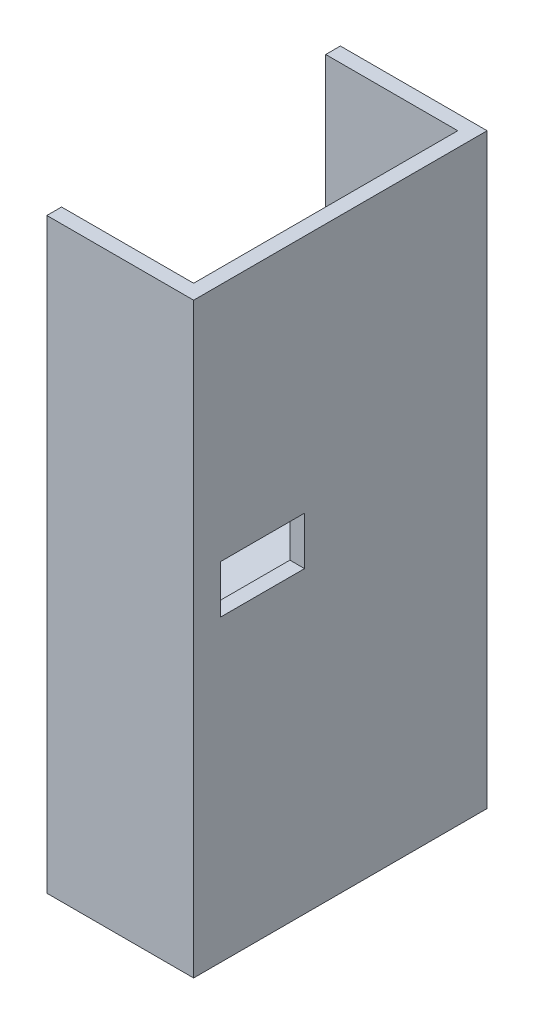
ISO-10303-21;
HEADER;
FILE_DESCRIPTION(('STEP AP214'),'2;1');
FILE_NAME('part.step','',(''),(''),'','','');
FILE_SCHEMA(('AUTOMOTIVE_DESIGN { 1 0 10303 214 1 1 1 1 }'));
ENDSEC;
DATA;
#1=APPLICATION_CONTEXT('core data for automotive mechanical design processes');
#2=APPLICATION_PROTOCOL_DEFINITION('international standard','automotive_design',2000,#1);
#3=PRODUCT_CONTEXT('',#1,'mechanical');
#4=PRODUCT('Part','Part','',(#3));
#5=PRODUCT_RELATED_PRODUCT_CATEGORY('part','',(#4));
#6=PRODUCT_DEFINITION_FORMATION('','',#4);
#7=PRODUCT_DEFINITION_CONTEXT('part definition',#1,'design');
#8=PRODUCT_DEFINITION('design','',#6,#7);
#9=PRODUCT_DEFINITION_SHAPE('','',#8);
#10=(LENGTH_UNIT() NAMED_UNIT(*) SI_UNIT(.MILLI.,.METRE.));
#11=(NAMED_UNIT(*) PLANE_ANGLE_UNIT() SI_UNIT($,.RADIAN.));
#12=(NAMED_UNIT(*) SI_UNIT($,.STERADIAN.) SOLID_ANGLE_UNIT());
#13=UNCERTAINTY_MEASURE_WITH_UNIT(LENGTH_MEASURE(1.E-05),#10,'distance_accuracy_value','');
#14=(GEOMETRIC_REPRESENTATION_CONTEXT(3) GLOBAL_UNCERTAINTY_ASSIGNED_CONTEXT((#13)) GLOBAL_UNIT_ASSIGNED_CONTEXT((#10,
#11,#12)) REPRESENTATION_CONTEXT('',''));
#15=CARTESIAN_POINT('',(0.,0.,0.));
#16=DIRECTION('',(0.,0.,1.));
#17=DIRECTION('',(1.,0.,0.));
#18=AXIS2_PLACEMENT_3D('',#15,#16,#17);
#19=CARTESIAN_POINT('',(0.,-0.00999999999999612,0.));
#20=DIRECTION('',(-1.,0.,0.));
#21=DIRECTION('',(0.,0.,1.));
#22=AXIS2_PLACEMENT_3D('',#19,#20,#21);
#23=PLANE('',#22);
#24=DIRECTION('',(0.,-1.,0.));
#25=VECTOR('',#24,1.);
#26=CARTESIAN_POINT('',(0.,80.,-20.));
#27=LINE('',#26,#25);
#28=CARTESIAN_POINT('',(0.,80.,-20.));
#29=VERTEX_POINT('',#28);
#30=CARTESIAN_POINT('',(0.,0.,-20.));
#31=VERTEX_POINT('',#30);
#32=EDGE_CURVE('E245',#29,#31,#27,.T.);
#33=ORIENTED_EDGE('',*,*,#32,.T.);
#34=DIRECTION('',(0.,0.,1.));
#35=VECTOR('',#34,1.);
#36=CARTESIAN_POINT('',(0.,0.,0.));
#37=LINE('',#36,#35);
#38=CARTESIAN_POINT('',(0.,0.,-12.5));
#39=VERTEX_POINT('',#38);
#40=EDGE_CURVE('E251',#31,#39,#37,.T.);
#41=ORIENTED_EDGE('',*,*,#40,.T.);
#42=DIRECTION('',(0.,-1.,0.));
#43=VECTOR('',#42,1.);
#44=CARTESIAN_POINT('',(0.,20.,-12.5));
#45=LINE('',#44,#43);
#46=CARTESIAN_POINT('',(0.,20.,-12.5));
#47=VERTEX_POINT('',#46);
#48=EDGE_CURVE('E255',#39,#47,#45,.F.);
#49=ORIENTED_EDGE('',*,*,#48,.T.);
#50=DIRECTION('',(0.,0.,-1.));
#51=VECTOR('',#50,1.);
#52=CARTESIAN_POINT('',(0.,20.,0.));
#53=LINE('',#52,#51);
#54=CARTESIAN_POINT('',(0.,20.,-5.));
#55=VERTEX_POINT('',#54);
#56=EDGE_CURVE('E239',#55,#47,#53,.T.);
#57=ORIENTED_EDGE('',*,*,#56,.F.);
#58=DIRECTION('',(0.,-1.,0.));
#59=VECTOR('',#58,1.);
#60=CARTESIAN_POINT('',(0.,60.,-5.));
#61=LINE('',#60,#59);
#62=CARTESIAN_POINT('',(0.,40.,-5.));
#63=VERTEX_POINT('',#62);
#64=EDGE_CURVE('E180',#55,#63,#61,.F.);
#65=ORIENTED_EDGE('',*,*,#64,.T.);
#66=DIRECTION('',(0.,0.,1.));
#67=VECTOR('',#66,1.);
#68=CARTESIAN_POINT('',(0.,40.,0.));
#69=LINE('',#68,#67);
#70=CARTESIAN_POINT('',(0.,40.,-18.));
#71=VERTEX_POINT('',#70);
#72=EDGE_CURVE('E162',#71,#63,#69,.T.);
#73=ORIENTED_EDGE('',*,*,#72,.F.);
#74=DIRECTION('',(0.,1.,0.));
#75=VECTOR('',#74,1.);
#76=CARTESIAN_POINT('',(0.,40.,-18.));
#77=LINE('',#76,#75);
#78=CARTESIAN_POINT('',(0.,80.,-18.));
#79=VERTEX_POINT('',#78);
#80=EDGE_CURVE('E182',#71,#79,#77,.T.);
#81=ORIENTED_EDGE('',*,*,#80,.T.);
#82=DIRECTION('',(0.,0.,1.));
#83=VECTOR('',#82,1.);
#84=CARTESIAN_POINT('',(0.,80.,0.));
#85=LINE('',#84,#83);
#86=EDGE_CURVE('E244',#29,#79,#85,.T.);
#87=ORIENTED_EDGE('',*,*,#86,.F.);
#88=EDGE_LOOP('',(#33,#41,#49,#57,#65,#73,#81,#87));
#89=FACE_BOUND('',#88,.T.);
#90=ADVANCED_FACE('F42',(#89),#23,.T.);
#91=DIRECTION('',(0.,-1.,0.));
#92=VECTOR('',#91,1.);
#93=CARTESIAN_POINT('',(0.,20.,12.5));
#94=LINE('',#93,#92);
#95=CARTESIAN_POINT('',(0.,20.,12.5));
#96=VERTEX_POINT('',#95);
#97=CARTESIAN_POINT('',(0.,0.,12.5));
#98=VERTEX_POINT('',#97);
#99=EDGE_CURVE('E258',#96,#98,#94,.T.);
#100=ORIENTED_EDGE('',*,*,#99,.T.);
#101=CARTESIAN_POINT('',(0.,0.,20.));
#102=VERTEX_POINT('',#101);
#103=EDGE_CURVE('E252',#98,#102,#37,.T.);
#104=ORIENTED_EDGE('',*,*,#103,.T.);
#105=DIRECTION('',(0.,1.,0.));
#106=VECTOR('',#105,1.);
#107=CARTESIAN_POINT('',(0.,80.,20.));
#108=LINE('',#107,#106);
#109=CARTESIAN_POINT('',(0.,80.,20.));
#110=VERTEX_POINT('',#109);
#111=EDGE_CURVE('E248',#102,#110,#108,.T.);
#112=ORIENTED_EDGE('',*,*,#111,.T.);
#113=CARTESIAN_POINT('',(0.,80.,18.));
#114=VERTEX_POINT('',#113);
#115=EDGE_CURVE('E242',#114,#110,#85,.T.);
#116=ORIENTED_EDGE('',*,*,#115,.F.);
#117=DIRECTION('',(0.,-1.,0.));
#118=VECTOR('',#117,1.);
#119=CARTESIAN_POINT('',(0.,40.,18.));
#120=LINE('',#119,#118);
#121=CARTESIAN_POINT('',(0.,40.,18.));
#122=VERTEX_POINT('',#121);
#123=EDGE_CURVE('E175',#114,#122,#120,.T.);
#124=ORIENTED_EDGE('',*,*,#123,.T.);
#125=CARTESIAN_POINT('',(0.,40.,5.));
#126=VERTEX_POINT('',#125);
#127=EDGE_CURVE('E160',#126,#122,#69,.T.);
#128=ORIENTED_EDGE('',*,*,#127,.F.);
#129=DIRECTION('',(0.,-1.,0.));
#130=VECTOR('',#129,1.);
#131=CARTESIAN_POINT('',(0.,60.,5.));
#132=LINE('',#131,#130);
#133=CARTESIAN_POINT('',(0.,20.,5.));
#134=VERTEX_POINT('',#133);
#135=EDGE_CURVE('E172',#126,#134,#132,.T.);
#136=ORIENTED_EDGE('',*,*,#135,.T.);
#137=EDGE_CURVE('E240',#96,#134,#53,.T.);
#138=ORIENTED_EDGE('',*,*,#137,.F.);
#139=EDGE_LOOP('',(#100,#104,#112,#116,#124,#128,#136,#138));
#140=FACE_BOUND('',#139,.T.);
#141=ADVANCED_FACE('F171',(#140),#23,.T.);
#142=CARTESIAN_POINT('',(-20.,80.,-20.));
#143=DIRECTION('',(0.,0.,1.));
#144=DIRECTION('',(1.,0.,0.));
#145=AXIS2_PLACEMENT_3D('',#142,#143,#144);
#146=PLANE('',#145);
#147=ORIENTED_EDGE('',*,*,#32,.F.);
#148=DIRECTION('',(-1.,0.,0.));
#149=VECTOR('',#148,1.);
#150=CARTESIAN_POINT('',(-20.,80.,-20.));
#151=LINE('',#150,#149);
#152=CARTESIAN_POINT('',(20.,80.,-20.));
#153=VERTEX_POINT('',#152);
#154=EDGE_CURVE('E188',#153,#29,#151,.T.);
#155=ORIENTED_EDGE('',*,*,#154,.F.);
#156=DIRECTION('',(0.,-1.,0.));
#157=VECTOR('',#156,1.);
#158=CARTESIAN_POINT('',(20.,80.,-20.));
#159=LINE('',#158,#157);
#160=CARTESIAN_POINT('',(20.,0.,-20.));
#161=VERTEX_POINT('',#160);
#162=EDGE_CURVE('E275',#153,#161,#159,.T.);
#163=ORIENTED_EDGE('',*,*,#162,.T.);
#164=DIRECTION('',(-1.,0.,0.));
#165=VECTOR('',#164,1.);
#166=CARTESIAN_POINT('',(-20.,0.,-20.));
#167=LINE('',#166,#165);
#168=EDGE_CURVE('E195',#161,#31,#167,.T.);
#169=ORIENTED_EDGE('',*,*,#168,.T.);
#170=EDGE_LOOP('',(#147,#155,#163,#169));
#171=FACE_BOUND('',#170,.T.);
#172=ADVANCED_FACE('F312',(#171),#146,.F.);
#173=CARTESIAN_POINT('',(-20.,80.,20.));
#174=DIRECTION('',(0.,0.,-1.));
#175=DIRECTION('',(-1.,0.,0.));
#176=AXIS2_PLACEMENT_3D('',#173,#174,#175);
#177=PLANE('',#176);
#178=ORIENTED_EDGE('',*,*,#111,.F.);
#179=DIRECTION('',(1.,0.,0.));
#180=VECTOR('',#179,1.);
#181=CARTESIAN_POINT('',(-20.,0.,20.));
#182=LINE('',#181,#180);
#183=CARTESIAN_POINT('',(20.,0.,20.));
#184=VERTEX_POINT('',#183);
#185=EDGE_CURVE('E193',#102,#184,#182,.T.);
#186=ORIENTED_EDGE('',*,*,#185,.T.);
#187=DIRECTION('',(0.,-1.,0.));
#188=VECTOR('',#187,1.);
#189=CARTESIAN_POINT('',(20.,80.,20.));
#190=LINE('',#189,#188);
#191=CARTESIAN_POINT('',(20.,80.,20.));
#192=VERTEX_POINT('',#191);
#193=EDGE_CURVE('E189',#192,#184,#190,.T.);
#194=ORIENTED_EDGE('',*,*,#193,.F.);
#195=DIRECTION('',(1.,0.,0.));
#196=VECTOR('',#195,1.);
#197=CARTESIAN_POINT('',(-20.,80.,20.));
#198=LINE('',#197,#196);
#199=EDGE_CURVE('E186',#110,#192,#198,.T.);
#200=ORIENTED_EDGE('',*,*,#199,.F.);
#201=EDGE_LOOP('',(#178,#186,#194,#200));
#202=FACE_BOUND('',#201,.T.);
#203=ADVANCED_FACE('F314',(#202),#177,.F.);
#204=CARTESIAN_POINT('',(0.,80.,0.));
#205=DIRECTION('',(0.,1.,0.));
#206=DIRECTION('',(0.,0.,1.));
#207=AXIS2_PLACEMENT_3D('',#204,#205,#206);
#208=PLANE('',#207);
#209=ORIENTED_EDGE('',*,*,#154,.T.);
#210=ORIENTED_EDGE('',*,*,#86,.T.);
#211=DIRECTION('',(-1.,0.,0.));
#212=VECTOR('',#211,1.);
#213=CARTESIAN_POINT('',(-18.,80.,-18.));
#214=LINE('',#213,#212);
#215=CARTESIAN_POINT('',(18.,80.,-18.));
#216=VERTEX_POINT('',#215);
#217=EDGE_CURVE('E212',#216,#79,#214,.T.);
#218=ORIENTED_EDGE('',*,*,#217,.F.);
#219=DIRECTION('',(0.,0.,-1.));
#220=VECTOR('',#219,1.);
#221=CARTESIAN_POINT('',(18.,80.,-18.));
#222=LINE('',#221,#220);
#223=CARTESIAN_POINT('',(18.,80.,18.));
#224=VERTEX_POINT('',#223);
#225=EDGE_CURVE('E167',#224,#216,#222,.T.);
#226=ORIENTED_EDGE('',*,*,#225,.F.);
#227=DIRECTION('',(1.,0.,0.));
#228=VECTOR('',#227,1.);
#229=CARTESIAN_POINT('',(-18.,80.,18.));
#230=LINE('',#229,#228);
#231=EDGE_CURVE('E210',#114,#224,#230,.T.);
#232=ORIENTED_EDGE('',*,*,#231,.F.);
#233=ORIENTED_EDGE('',*,*,#115,.T.);
#234=ORIENTED_EDGE('',*,*,#199,.T.);
#235=DIRECTION('',(0.,0.,-1.));
#236=VECTOR('',#235,1.);
#237=CARTESIAN_POINT('',(20.,80.,-20.));
#238=LINE('',#237,#236);
#239=EDGE_CURVE('E192',#192,#153,#238,.T.);
#240=ORIENTED_EDGE('',*,*,#239,.T.);
#241=EDGE_LOOP('',(#209,#210,#218,#226,#232,#233,#234,#240));
#242=FACE_BOUND('',#241,.T.);
#243=ADVANCED_FACE('F321',(#242),#208,.T.);
#244=CARTESIAN_POINT('',(0.,0.,0.));
#245=DIRECTION('',(0.,1.,0.));
#246=DIRECTION('',(0.,0.,1.));
#247=AXIS2_PLACEMENT_3D('',#244,#245,#246);
#248=PLANE('',#247);
#249=ORIENTED_EDGE('',*,*,#40,.F.);
#250=ORIENTED_EDGE('',*,*,#168,.F.);
#251=DIRECTION('',(0.,0.,-1.));
#252=VECTOR('',#251,1.);
#253=CARTESIAN_POINT('',(20.,0.,-20.));
#254=LINE('',#253,#252);
#255=EDGE_CURVE('E197',#184,#161,#254,.T.);
#256=ORIENTED_EDGE('',*,*,#255,.F.);
#257=ORIENTED_EDGE('',*,*,#185,.F.);
#258=ORIENTED_EDGE('',*,*,#103,.F.);
#259=CARTESIAN_POINT('',(0.,0.,0.));
#260=DIRECTION('',(0.,-1.,0.));
#261=DIRECTION('',(0.,0.,-1.));
#262=AXIS2_PLACEMENT_3D('',#259,#260,#261);
#263=CIRCLE('',#262,12.5);
#264=EDGE_CURVE('E201',#39,#98,#263,.T.);
#265=ORIENTED_EDGE('',*,*,#264,.F.);
#266=EDGE_LOOP('',(#249,#250,#256,#257,#258,#265));
#267=FACE_BOUND('',#266,.T.);
#268=ADVANCED_FACE('F326',(#267),#248,.F.);
#269=CARTESIAN_POINT('',(0.,20.,0.));
#270=DIRECTION('',(0.,-1.,0.));
#271=DIRECTION('',(0.,0.,-1.));
#272=AXIS2_PLACEMENT_3D('',#269,#270,#271);
#273=CYLINDRICAL_SURFACE('',#272,12.5);
#274=ORIENTED_EDGE('',*,*,#48,.F.);
#275=ORIENTED_EDGE('',*,*,#264,.T.);
#276=ORIENTED_EDGE('',*,*,#99,.F.);
#277=CARTESIAN_POINT('',(0.,20.,0.));
#278=DIRECTION('',(0.,-1.,0.));
#279=DIRECTION('',(0.,0.,-1.));
#280=AXIS2_PLACEMENT_3D('',#277,#278,#279);
#281=CIRCLE('',#280,12.5);
#282=EDGE_CURVE('E198',#47,#96,#281,.T.);
#283=ORIENTED_EDGE('',*,*,#282,.F.);
#284=EDGE_LOOP('',(#274,#275,#276,#283));
#285=FACE_BOUND('',#284,.T.);
#286=ADVANCED_FACE('F329',(#285),#273,.F.);
#287=CARTESIAN_POINT('',(0.,20.,0.));
#288=DIRECTION('',(0.,-1.,0.));
#289=DIRECTION('',(0.,0.,-1.));
#290=AXIS2_PLACEMENT_3D('',#287,#288,#289);
#291=PLANE('',#290);
#292=ORIENTED_EDGE('',*,*,#282,.T.);
#293=ORIENTED_EDGE('',*,*,#137,.T.);
#294=CARTESIAN_POINT('',(0.,20.,0.));
#295=DIRECTION('',(0.,-1.,0.));
#296=DIRECTION('',(0.,0.,-1.));
#297=AXIS2_PLACEMENT_3D('',#294,#295,#296);
#298=CIRCLE('',#297,5.);
#299=EDGE_CURVE('E46',#55,#134,#298,.T.);
#300=ORIENTED_EDGE('',*,*,#299,.F.);
#301=ORIENTED_EDGE('',*,*,#56,.T.);
#302=EDGE_LOOP('',(#292,#293,#300,#301));
#303=FACE_BOUND('',#302,.T.);
#304=ADVANCED_FACE('F333',(#303),#291,.T.);
#305=CARTESIAN_POINT('',(-18.,40.,18.));
#306=DIRECTION('',(0.,0.,1.));
#307=DIRECTION('',(1.,0.,0.));
#308=AXIS2_PLACEMENT_3D('',#305,#306,#307);
#309=PLANE('',#308);
#310=ORIENTED_EDGE('',*,*,#123,.F.);
#311=ORIENTED_EDGE('',*,*,#231,.T.);
#312=DIRECTION('',(0.,1.,0.));
#313=VECTOR('',#312,1.);
#314=CARTESIAN_POINT('',(18.,40.,18.));
#315=LINE('',#314,#313);
#316=CARTESIAN_POINT('',(18.,40.,18.));
#317=VERTEX_POINT('',#316);
#318=EDGE_CURVE('E203',#317,#224,#315,.T.);
#319=ORIENTED_EDGE('',*,*,#318,.F.);
#320=DIRECTION('',(1.,0.,0.));
#321=VECTOR('',#320,1.);
#322=CARTESIAN_POINT('',(-18.,40.,18.));
#323=LINE('',#322,#321);
#324=EDGE_CURVE('E204',#122,#317,#323,.T.);
#325=ORIENTED_EDGE('',*,*,#324,.F.);
#326=EDGE_LOOP('',(#310,#311,#319,#325));
#327=FACE_BOUND('',#326,.T.);
#328=ADVANCED_FACE('F338',(#327),#309,.F.);
#329=CARTESIAN_POINT('',(-18.,40.,-18.));
#330=DIRECTION('',(0.,0.,-1.));
#331=DIRECTION('',(-1.,0.,0.));
#332=AXIS2_PLACEMENT_3D('',#329,#330,#331);
#333=PLANE('',#332);
#334=ORIENTED_EDGE('',*,*,#80,.F.);
#335=DIRECTION('',(-1.,0.,0.));
#336=VECTOR('',#335,1.);
#337=CARTESIAN_POINT('',(-18.,40.,-18.));
#338=LINE('',#337,#336);
#339=CARTESIAN_POINT('',(18.,40.,-18.));
#340=VERTEX_POINT('',#339);
#341=EDGE_CURVE('E206',#340,#71,#338,.T.);
#342=ORIENTED_EDGE('',*,*,#341,.F.);
#343=DIRECTION('',(0.,1.,0.));
#344=VECTOR('',#343,1.);
#345=CARTESIAN_POINT('',(18.,40.,-18.));
#346=LINE('',#345,#344);
#347=EDGE_CURVE('E207',#340,#216,#346,.T.);
#348=ORIENTED_EDGE('',*,*,#347,.T.);
#349=ORIENTED_EDGE('',*,*,#217,.T.);
#350=EDGE_LOOP('',(#334,#342,#348,#349));
#351=FACE_BOUND('',#350,.T.);
#352=ADVANCED_FACE('F264',(#351),#333,.F.);
#353=CARTESIAN_POINT('',(0.,40.,0.));
#354=DIRECTION('',(0.,1.,0.));
#355=DIRECTION('',(0.,0.,1.));
#356=AXIS2_PLACEMENT_3D('',#353,#354,#355);
#357=PLANE('',#356);
#358=ORIENTED_EDGE('',*,*,#341,.T.);
#359=ORIENTED_EDGE('',*,*,#72,.T.);
#360=CARTESIAN_POINT('',(0.,40.,0.));
#361=DIRECTION('',(0.,1.,0.));
#362=DIRECTION('',(0.,0.,1.));
#363=AXIS2_PLACEMENT_3D('',#360,#361,#362);
#364=CIRCLE('',#363,5.);
#365=EDGE_CURVE('E156',#126,#63,#364,.T.);
#366=ORIENTED_EDGE('',*,*,#365,.F.);
#367=ORIENTED_EDGE('',*,*,#127,.T.);
#368=ORIENTED_EDGE('',*,*,#324,.T.);
#369=DIRECTION('',(0.,0.,-1.));
#370=VECTOR('',#369,1.);
#371=CARTESIAN_POINT('',(18.,40.,-18.));
#372=LINE('',#371,#370);
#373=EDGE_CURVE('E209',#317,#340,#372,.T.);
#374=ORIENTED_EDGE('',*,*,#373,.T.);
#375=EDGE_LOOP('',(#358,#359,#366,#367,#368,#374));
#376=FACE_BOUND('',#375,.T.);
#377=ADVANCED_FACE('F159',(#376),#357,.T.);
#378=CARTESIAN_POINT('',(0.,60.,0.));
#379=DIRECTION('',(0.,-1.,0.));
#380=DIRECTION('',(0.,0.,-1.));
#381=AXIS2_PLACEMENT_3D('',#378,#379,#380);
#382=CYLINDRICAL_SURFACE('',#381,5.);
#383=ORIENTED_EDGE('',*,*,#64,.F.);
#384=ORIENTED_EDGE('',*,*,#299,.T.);
#385=ORIENTED_EDGE('',*,*,#135,.F.);
#386=ORIENTED_EDGE('',*,*,#365,.T.);
#387=EDGE_LOOP('',(#383,#384,#385,#386));
#388=FACE_BOUND('',#387,.T.);
#389=ADVANCED_FACE('F44',(#388),#382,.F.);
#390=CARTESIAN_POINT('',(20.,80.,-20.));
#391=DIRECTION('',(-1.,0.,0.));
#392=DIRECTION('',(0.,0.,1.));
#393=AXIS2_PLACEMENT_3D('',#390,#391,#392);
#394=PLANE('',#393);
#395=DIRECTION('',(0.,0.,-1.));
#396=VECTOR('',#395,1.);
#397=CARTESIAN_POINT('',(20.,40.7593065522647,16.3135347981753));
#398=LINE('',#397,#396);
#399=CARTESIAN_POINT('',(20.,40.7593065522647,16.3135347981753));
#400=VERTEX_POINT('',#399);
#401=CARTESIAN_POINT('',(20.,40.7593065522647,4.8821527498189));
#402=VERTEX_POINT('',#401);
#403=EDGE_CURVE('E51',#400,#402,#398,.T.);
#404=ORIENTED_EDGE('',*,*,#403,.F.);
#405=DIRECTION('',(0.,-1.,0.));
#406=VECTOR('',#405,1.);
#407=CARTESIAN_POINT('',(20.,47.3085358508023,16.3135347981753));
#408=LINE('',#407,#406);
#409=CARTESIAN_POINT('',(20.,47.3085358508023,16.3135347981753));
#410=VERTEX_POINT('',#409);
#411=EDGE_CURVE('E11',#410,#400,#408,.T.);
#412=ORIENTED_EDGE('',*,*,#411,.F.);
#413=DIRECTION('',(0.,0.,1.));
#414=VECTOR('',#413,1.);
#415=CARTESIAN_POINT('',(20.,47.3085358508023,16.3135347981753));
#416=LINE('',#415,#414);
#417=CARTESIAN_POINT('',(20.,47.3085358508023,4.8821527498189));
#418=VERTEX_POINT('',#417);
#419=EDGE_CURVE('E230',#418,#410,#416,.T.);
#420=ORIENTED_EDGE('',*,*,#419,.F.);
#421=DIRECTION('',(0.,1.,0.));
#422=VECTOR('',#421,1.);
#423=CARTESIAN_POINT('',(20.,47.3085358508023,4.8821527498189));
#424=LINE('',#423,#422);
#425=EDGE_CURVE('E236',#402,#418,#424,.T.);
#426=ORIENTED_EDGE('',*,*,#425,.F.);
#427=EDGE_LOOP('',(#404,#412,#420,#426));
#428=FACE_BOUND('',#427,.T.);
#429=ORIENTED_EDGE('',*,*,#255,.T.);
#430=ORIENTED_EDGE('',*,*,#162,.F.);
#431=ORIENTED_EDGE('',*,*,#239,.F.);
#432=ORIENTED_EDGE('',*,*,#193,.T.);
#433=EDGE_LOOP('',(#429,#430,#431,#432));
#434=FACE_BOUND('',#433,.T.);
#435=ADVANCED_FACE('F299',(#428,#434),#394,.F.);
#436=CARTESIAN_POINT('',(18.,40.,-18.));
#437=DIRECTION('',(1.,0.,0.));
#438=DIRECTION('',(0.,0.,-1.));
#439=AXIS2_PLACEMENT_3D('',#436,#437,#438);
#440=PLANE('',#439);
#441=DIRECTION('',(0.,0.,1.));
#442=VECTOR('',#441,1.);
#443=CARTESIAN_POINT('',(18.,47.3085358508023,-18.));
#444=LINE('',#443,#442);
#445=CARTESIAN_POINT('',(18.,47.3085358508023,4.8821527498189));
#446=VERTEX_POINT('',#445);
#447=CARTESIAN_POINT('',(18.,47.3085358508023,16.3135347981753));
#448=VERTEX_POINT('',#447);
#449=EDGE_CURVE('E284',#446,#448,#444,.T.);
#450=ORIENTED_EDGE('',*,*,#449,.T.);
#451=DIRECTION('',(0.,-1.,0.));
#452=VECTOR('',#451,1.);
#453=CARTESIAN_POINT('',(18.,40.,16.3135347981753));
#454=LINE('',#453,#452);
#455=CARTESIAN_POINT('',(18.,40.7593065522647,16.3135347981753));
#456=VERTEX_POINT('',#455);
#457=EDGE_CURVE('E177',#448,#456,#454,.T.);
#458=ORIENTED_EDGE('',*,*,#457,.T.);
#459=DIRECTION('',(0.,0.,-1.));
#460=VECTOR('',#459,1.);
#461=CARTESIAN_POINT('',(18.,40.7593065522647,-18.));
#462=LINE('',#461,#460);
#463=CARTESIAN_POINT('',(18.,40.7593065522647,4.88215274981891));
#464=VERTEX_POINT('',#463);
#465=EDGE_CURVE('E278',#456,#464,#462,.T.);
#466=ORIENTED_EDGE('',*,*,#465,.T.);
#467=DIRECTION('',(0.,1.,0.));
#468=VECTOR('',#467,1.);
#469=CARTESIAN_POINT('',(18.,40.,4.8821527498189));
#470=LINE('',#469,#468);
#471=EDGE_CURVE('E281',#464,#446,#470,.T.);
#472=ORIENTED_EDGE('',*,*,#471,.T.);
#473=EDGE_LOOP('',(#450,#458,#466,#472));
#474=FACE_BOUND('',#473,.T.);
#475=ORIENTED_EDGE('',*,*,#225,.T.);
#476=ORIENTED_EDGE('',*,*,#347,.F.);
#477=ORIENTED_EDGE('',*,*,#373,.F.);
#478=ORIENTED_EDGE('',*,*,#318,.T.);
#479=EDGE_LOOP('',(#475,#476,#477,#478));
#480=FACE_BOUND('',#479,.T.);
#481=ADVANCED_FACE('F267',(#474,#480),#440,.F.);
#482=CARTESIAN_POINT('',(9.99999999999999,47.3085358508023,16.3135347981753));
#483=DIRECTION('',(0.,0.,1.));
#484=DIRECTION('',(1.,0.,0.));
#485=AXIS2_PLACEMENT_3D('',#482,#483,#484);
#486=PLANE('',#485);
#487=DIRECTION('',(1.,0.,0.));
#488=VECTOR('',#487,1.);
#489=CARTESIAN_POINT('',(9.99999999999999,47.3085358508023,16.3135347981753));
#490=LINE('',#489,#488);
#491=EDGE_CURVE('E233',#448,#410,#490,.T.);
#492=ORIENTED_EDGE('',*,*,#491,.T.);
#493=ORIENTED_EDGE('',*,*,#411,.T.);
#494=DIRECTION('',(1.,0.,0.));
#495=VECTOR('',#494,1.);
#496=CARTESIAN_POINT('',(9.99999999999999,40.7593065522647,16.3135347981753));
#497=LINE('',#496,#495);
#498=EDGE_CURVE('E227',#456,#400,#497,.T.);
#499=ORIENTED_EDGE('',*,*,#498,.F.);
#500=ORIENTED_EDGE('',*,*,#457,.F.);
#501=EDGE_LOOP('',(#492,#493,#499,#500));
#502=FACE_BOUND('',#501,.T.);
#503=ADVANCED_FACE('F292',(#502),#486,.F.);
#504=CARTESIAN_POINT('',(9.99999999999999,47.3085358508023,16.3135347981753));
#505=DIRECTION('',(0.,1.,0.));
#506=DIRECTION('',(0.,0.,1.));
#507=AXIS2_PLACEMENT_3D('',#504,#505,#506);
#508=PLANE('',#507);
#509=DIRECTION('',(1.,0.,0.));
#510=VECTOR('',#509,1.);
#511=CARTESIAN_POINT('',(10.,47.3085358508023,4.8821527498189));
#512=LINE('',#511,#510);
#513=EDGE_CURVE('E67',#446,#418,#512,.T.);
#514=ORIENTED_EDGE('',*,*,#513,.T.);
#515=ORIENTED_EDGE('',*,*,#419,.T.);
#516=ORIENTED_EDGE('',*,*,#491,.F.);
#517=ORIENTED_EDGE('',*,*,#449,.F.);
#518=EDGE_LOOP('',(#514,#515,#516,#517));
#519=FACE_BOUND('',#518,.T.);
#520=ADVANCED_FACE('F293',(#519),#508,.F.);
#521=CARTESIAN_POINT('',(10.,47.3085358508023,4.8821527498189));
#522=DIRECTION('',(0.,0.,-1.));
#523=DIRECTION('',(-1.,0.,0.));
#524=AXIS2_PLACEMENT_3D('',#521,#522,#523);
#525=PLANE('',#524);
#526=DIRECTION('',(1.,0.,0.));
#527=VECTOR('',#526,1.);
#528=CARTESIAN_POINT('',(10.,40.7593065522647,4.8821527498189));
#529=LINE('',#528,#527);
#530=EDGE_CURVE('E59',#464,#402,#529,.T.);
#531=ORIENTED_EDGE('',*,*,#530,.T.);
#532=ORIENTED_EDGE('',*,*,#425,.T.);
#533=ORIENTED_EDGE('',*,*,#513,.F.);
#534=ORIENTED_EDGE('',*,*,#471,.F.);
#535=EDGE_LOOP('',(#531,#532,#533,#534));
#536=FACE_BOUND('',#535,.T.);
#537=ADVANCED_FACE('F303',(#536),#525,.F.);
#538=CARTESIAN_POINT('',(9.99999999999999,40.7593065522647,16.3135347981753));
#539=DIRECTION('',(0.,-1.,0.));
#540=DIRECTION('',(0.,0.,-1.));
#541=AXIS2_PLACEMENT_3D('',#538,#539,#540);
#542=PLANE('',#541);
#543=ORIENTED_EDGE('',*,*,#498,.T.);
#544=ORIENTED_EDGE('',*,*,#403,.T.);
#545=ORIENTED_EDGE('',*,*,#530,.F.);
#546=ORIENTED_EDGE('',*,*,#465,.F.);
#547=EDGE_LOOP('',(#543,#544,#545,#546));
#548=FACE_BOUND('',#547,.T.);
#549=ADVANCED_FACE('F302',(#548),#542,.F.);
#550=CLOSED_SHELL('',(#90,#141,#172,#203,#243,#268,#286,#304,#328,#352,#377,#389,#435,#481,#503,
#520,#537,#549));
#551=MANIFOLD_SOLID_BREP('B2',#550);
#552=ADVANCED_BREP_SHAPE_REPRESENTATION('',(#18,#551),#14);
#553=SHAPE_DEFINITION_REPRESENTATION(#9,#552);
ENDSEC;
END-ISO-10303-21;
